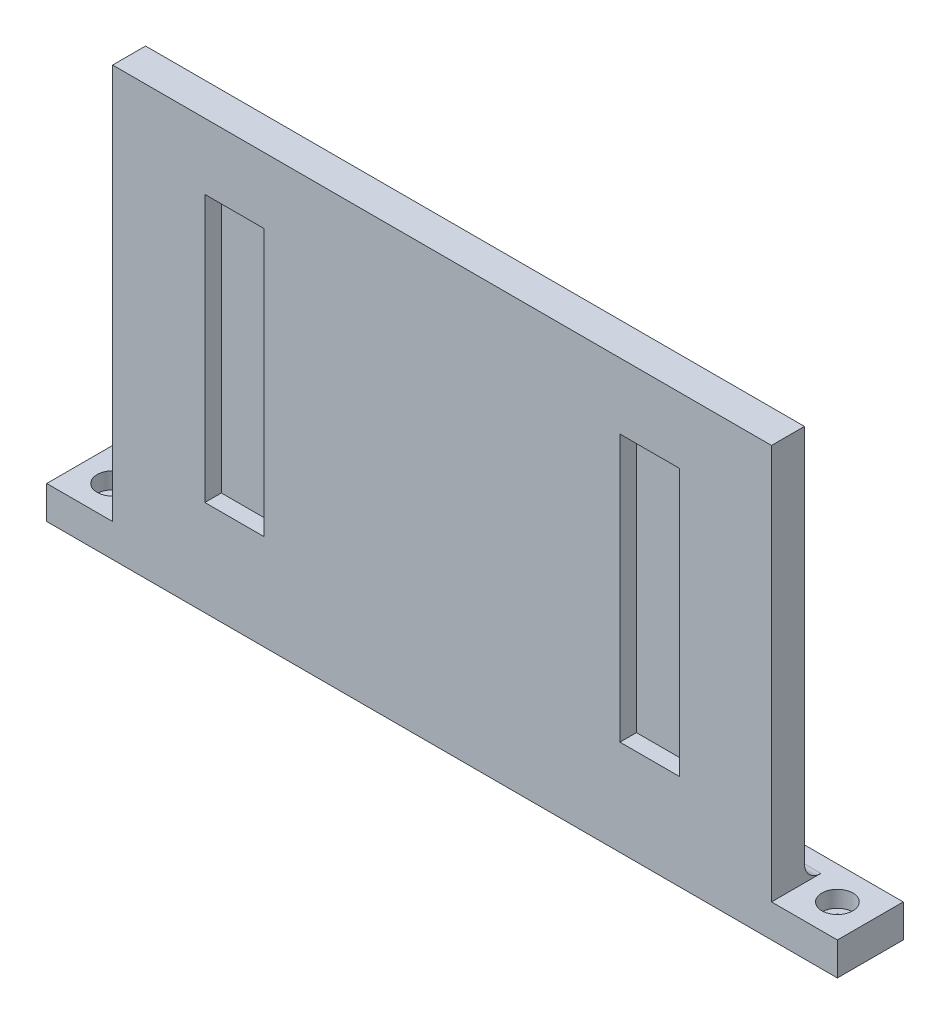
ISO-10303-21;
HEADER;
FILE_DESCRIPTION(('STEP AP214'),'2;1');
FILE_NAME('part.step','',(''),(''),'','','');
FILE_SCHEMA(('AUTOMOTIVE_DESIGN { 1 0 10303 214 1 1 1 1 }'));
ENDSEC;
DATA;
#1=APPLICATION_CONTEXT('core data for automotive mechanical design processes');
#2=APPLICATION_PROTOCOL_DEFINITION('international standard','automotive_design',2000,#1);
#3=PRODUCT_CONTEXT('',#1,'mechanical');
#4=PRODUCT('Part','Part','',(#3));
#5=PRODUCT_RELATED_PRODUCT_CATEGORY('part','',(#4));
#6=PRODUCT_DEFINITION_FORMATION('','',#4);
#7=PRODUCT_DEFINITION_CONTEXT('part definition',#1,'design');
#8=PRODUCT_DEFINITION('design','',#6,#7);
#9=PRODUCT_DEFINITION_SHAPE('','',#8);
#10=(LENGTH_UNIT() NAMED_UNIT(*) SI_UNIT(.MILLI.,.METRE.));
#11=(NAMED_UNIT(*) PLANE_ANGLE_UNIT() SI_UNIT($,.RADIAN.));
#12=(NAMED_UNIT(*) SI_UNIT($,.STERADIAN.) SOLID_ANGLE_UNIT());
#13=UNCERTAINTY_MEASURE_WITH_UNIT(LENGTH_MEASURE(1.E-05),#10,'distance_accuracy_value','');
#14=(GEOMETRIC_REPRESENTATION_CONTEXT(3) GLOBAL_UNCERTAINTY_ASSIGNED_CONTEXT((#13)) GLOBAL_UNIT_ASSIGNED_CONTEXT((#10,
#11,#12)) REPRESENTATION_CONTEXT('',''));
#15=CARTESIAN_POINT('',(0.,0.,0.));
#16=DIRECTION('',(0.,0.,1.));
#17=DIRECTION('',(1.,0.,0.));
#18=AXIS2_PLACEMENT_3D('',#15,#16,#17);
#19=CARTESIAN_POINT('',(10.,18.4852813742386,10.));
#20=DIRECTION('',(0.,-1.,0.));
#21=DIRECTION('',(0.,0.,-1.));
#22=AXIS2_PLACEMENT_3D('',#19,#20,#21);
#23=CYLINDRICAL_SURFACE('',#22,2.5);
#24=CARTESIAN_POINT('',(10.,0.,10.));
#25=DIRECTION('',(0.,-1.,0.));
#26=DIRECTION('',(0.,0.,-1.));
#27=AXIS2_PLACEMENT_3D('',#24,#25,#26);
#28=CIRCLE('',#27,2.5);
#29=CARTESIAN_POINT('',(10.,0.,7.5));
#30=VERTEX_POINT('',#29);
#31=EDGE_CURVE('E245',#30,#30,#28,.T.);
#32=ORIENTED_EDGE('',*,*,#31,.T.);
#33=EDGE_LOOP('',(#32));
#34=FACE_BOUND('',#33,.T.);
#35=CARTESIAN_POINT('',(10.,5.,10.));
#36=DIRECTION('',(0.,1.,0.));
#37=DIRECTION('',(-1.,0.,0.));
#38=AXIS2_PLACEMENT_3D('',#35,#36,#37);
#39=CIRCLE('',#38,2.5);
#40=CARTESIAN_POINT('',(7.5,5.,10.));
#41=VERTEX_POINT('',#40);
#42=EDGE_CURVE('E45',#41,#41,#39,.F.);
#43=ORIENTED_EDGE('',*,*,#42,.F.);
#44=EDGE_LOOP('',(#43));
#45=FACE_BOUND('',#44,.T.);
#46=ADVANCED_FACE('F41',(#34,#45),#23,.F.);
#47=CARTESIAN_POINT('',(230.,18.4852813742386,10.));
#48=DIRECTION('',(0.,-1.,0.));
#49=DIRECTION('',(0.,0.,-1.));
#50=AXIS2_PLACEMENT_3D('',#47,#48,#49);
#51=CYLINDRICAL_SURFACE('',#50,2.5);
#52=CARTESIAN_POINT('',(230.,0.,10.));
#53=DIRECTION('',(0.,-1.,0.));
#54=DIRECTION('',(0.,0.,-1.));
#55=AXIS2_PLACEMENT_3D('',#52,#53,#54);
#56=CIRCLE('',#55,2.5);
#57=CARTESIAN_POINT('',(230.,0.,7.50000000000001));
#58=VERTEX_POINT('',#57);
#59=EDGE_CURVE('E242',#58,#58,#56,.T.);
#60=ORIENTED_EDGE('',*,*,#59,.T.);
#61=EDGE_LOOP('',(#60));
#62=FACE_BOUND('',#61,.T.);
#63=CARTESIAN_POINT('',(230.,5.00000000000002,10.));
#64=DIRECTION('',(0.,1.,0.));
#65=DIRECTION('',(-1.,0.,0.));
#66=AXIS2_PLACEMENT_3D('',#63,#64,#65);
#67=CIRCLE('',#66,2.5);
#68=CARTESIAN_POINT('',(227.5,5.00000000000002,10.));
#69=VERTEX_POINT('',#68);
#70=EDGE_CURVE('E233',#69,#69,#67,.F.);
#71=ORIENTED_EDGE('',*,*,#70,.F.);
#72=EDGE_LOOP('',(#71));
#73=FACE_BOUND('',#72,.T.);
#74=ADVANCED_FACE('F320',(#62,#73),#51,.F.);
#75=CARTESIAN_POINT('',(220.,10.,20.));
#76=DIRECTION('',(-1.,0.,0.));
#77=DIRECTION('',(0.,0.,1.));
#78=AXIS2_PLACEMENT_3D('',#75,#76,#77);
#79=PLANE('',#78);
#80=DIRECTION('',(0.,-1.,0.));
#81=VECTOR('',#80,1.);
#82=CARTESIAN_POINT('',(220.,130.,10.));
#83=LINE('',#82,#81);
#84=CARTESIAN_POINT('',(220.,130.,10.));
#85=VERTEX_POINT('',#84);
#86=CARTESIAN_POINT('',(220.,15.,10.));
#87=VERTEX_POINT('',#86);
#88=EDGE_CURVE('E248',#85,#87,#83,.T.);
#89=ORIENTED_EDGE('',*,*,#88,.F.);
#90=DIRECTION('',(0.,0.,-1.));
#91=VECTOR('',#90,1.);
#92=CARTESIAN_POINT('',(220.,130.,20.));
#93=LINE('',#92,#91);
#94=CARTESIAN_POINT('',(220.,130.,20.));
#95=VERTEX_POINT('',#94);
#96=EDGE_CURVE('E290',#95,#85,#93,.T.);
#97=ORIENTED_EDGE('',*,*,#96,.F.);
#98=DIRECTION('',(0.,1.,0.));
#99=VECTOR('',#98,1.);
#100=CARTESIAN_POINT('',(220.,10.,20.));
#101=LINE('',#100,#99);
#102=CARTESIAN_POINT('',(220.,10.,20.));
#103=VERTEX_POINT('',#102);
#104=EDGE_CURVE('E266',#103,#95,#101,.T.);
#105=ORIENTED_EDGE('',*,*,#104,.F.);
#106=DIRECTION('',(0.,0.,-1.));
#107=VECTOR('',#106,1.);
#108=CARTESIAN_POINT('',(220.,10.,20.));
#109=LINE('',#108,#107);
#110=CARTESIAN_POINT('',(220.,10.,5.));
#111=VERTEX_POINT('',#110);
#112=EDGE_CURVE('E293',#103,#111,#109,.T.);
#113=ORIENTED_EDGE('',*,*,#112,.T.);
#114=CARTESIAN_POINT('',(220.,15.,5.));
#115=DIRECTION('',(-1.,0.,0.));
#116=DIRECTION('',(0.,0.,1.));
#117=AXIS2_PLACEMENT_3D('',#114,#115,#116);
#118=CIRCLE('',#117,5.);
#119=EDGE_CURVE('E11',#111,#87,#118,.T.);
#120=ORIENTED_EDGE('',*,*,#119,.T.);
#121=EDGE_LOOP('',(#89,#97,#105,#113,#120));
#122=FACE_BOUND('',#121,.T.);
#123=ADVANCED_FACE('F326',(#122),#79,.F.);
#124=CARTESIAN_POINT('',(220.,130.,20.));
#125=DIRECTION('',(0.,-1.,0.));
#126=DIRECTION('',(1.,0.,0.));
#127=AXIS2_PLACEMENT_3D('',#124,#125,#126);
#128=PLANE('',#127);
#129=DIRECTION('',(1.,0.,0.));
#130=VECTOR('',#129,1.);
#131=CARTESIAN_POINT('',(220.,130.,10.));
#132=LINE('',#131,#130);
#133=CARTESIAN_POINT('',(20.,130.,10.));
#134=VERTEX_POINT('',#133);
#135=EDGE_CURVE('E253',#134,#85,#132,.T.);
#136=ORIENTED_EDGE('',*,*,#135,.F.);
#137=DIRECTION('',(0.,0.,-1.));
#138=VECTOR('',#137,1.);
#139=CARTESIAN_POINT('',(20.,130.,20.));
#140=LINE('',#139,#138);
#141=CARTESIAN_POINT('',(20.,130.,20.));
#142=VERTEX_POINT('',#141);
#143=EDGE_CURVE('E287',#142,#134,#140,.T.);
#144=ORIENTED_EDGE('',*,*,#143,.F.);
#145=DIRECTION('',(-1.,0.,0.));
#146=VECTOR('',#145,1.);
#147=CARTESIAN_POINT('',(220.,130.,20.));
#148=LINE('',#147,#146);
#149=EDGE_CURVE('E268',#95,#142,#148,.T.);
#150=ORIENTED_EDGE('',*,*,#149,.F.);
#151=ORIENTED_EDGE('',*,*,#96,.T.);
#152=EDGE_LOOP('',(#136,#144,#150,#151));
#153=FACE_BOUND('',#152,.T.);
#154=ADVANCED_FACE('F352',(#153),#128,.F.);
#155=CARTESIAN_POINT('',(20.,130.,20.));
#156=DIRECTION('',(1.,0.,0.));
#157=DIRECTION('',(0.,1.,0.));
#158=AXIS2_PLACEMENT_3D('',#155,#156,#157);
#159=PLANE('',#158);
#160=DIRECTION('',(0.,1.,0.));
#161=VECTOR('',#160,1.);
#162=CARTESIAN_POINT('',(20.,130.,10.));
#163=LINE('',#162,#161);
#164=CARTESIAN_POINT('',(20.,15.,10.));
#165=VERTEX_POINT('',#164);
#166=EDGE_CURVE('E251',#165,#134,#163,.T.);
#167=ORIENTED_EDGE('',*,*,#166,.F.);
#168=CARTESIAN_POINT('',(20.,15.,5.));
#169=DIRECTION('',(1.,0.,0.));
#170=DIRECTION('',(0.,1.,0.));
#171=AXIS2_PLACEMENT_3D('',#168,#169,#170);
#172=CIRCLE('',#171,5.);
#173=CARTESIAN_POINT('',(20.,10.,5.));
#174=VERTEX_POINT('',#173);
#175=EDGE_CURVE('E50',#165,#174,#172,.T.);
#176=ORIENTED_EDGE('',*,*,#175,.T.);
#177=DIRECTION('',(0.,0.,-1.));
#178=VECTOR('',#177,1.);
#179=CARTESIAN_POINT('',(20.,10.,20.));
#180=LINE('',#179,#178);
#181=CARTESIAN_POINT('',(20.,10.,20.));
#182=VERTEX_POINT('',#181);
#183=EDGE_CURVE('E285',#182,#174,#180,.T.);
#184=ORIENTED_EDGE('',*,*,#183,.F.);
#185=DIRECTION('',(0.,-1.,0.));
#186=VECTOR('',#185,1.);
#187=CARTESIAN_POINT('',(20.,130.,20.));
#188=LINE('',#187,#186);
#189=EDGE_CURVE('E270',#142,#182,#188,.T.);
#190=ORIENTED_EDGE('',*,*,#189,.F.);
#191=ORIENTED_EDGE('',*,*,#143,.T.);
#192=EDGE_LOOP('',(#167,#176,#184,#190,#191));
#193=FACE_BOUND('',#192,.T.);
#194=ADVANCED_FACE('F348',(#193),#159,.F.);
#195=CARTESIAN_POINT('',(0.,10.,20.));
#196=DIRECTION('',(1.,0.,0.));
#197=DIRECTION('',(0.,1.,0.));
#198=AXIS2_PLACEMENT_3D('',#195,#196,#197);
#199=PLANE('',#198);
#200=DIRECTION('',(0.,-1.,0.));
#201=VECTOR('',#200,1.);
#202=CARTESIAN_POINT('',(0.,10.,0.));
#203=LINE('',#202,#201);
#204=CARTESIAN_POINT('',(0.,10.,0.));
#205=VERTEX_POINT('',#204);
#206=CARTESIAN_POINT('',(0.,0.,0.));
#207=VERTEX_POINT('',#206);
#208=EDGE_CURVE('E255',#205,#207,#203,.T.);
#209=ORIENTED_EDGE('',*,*,#208,.T.);
#210=DIRECTION('',(0.,0.,-1.));
#211=VECTOR('',#210,1.);
#212=CARTESIAN_POINT('',(0.,0.,20.));
#213=LINE('',#212,#211);
#214=CARTESIAN_POINT('',(0.,0.,20.));
#215=VERTEX_POINT('',#214);
#216=EDGE_CURVE('E301',#215,#207,#213,.T.);
#217=ORIENTED_EDGE('',*,*,#216,.F.);
#218=DIRECTION('',(0.,-1.,0.));
#219=VECTOR('',#218,1.);
#220=CARTESIAN_POINT('',(0.,10.,20.));
#221=LINE('',#220,#219);
#222=CARTESIAN_POINT('',(0.,10.,20.));
#223=VERTEX_POINT('',#222);
#224=EDGE_CURVE('E256',#223,#215,#221,.T.);
#225=ORIENTED_EDGE('',*,*,#224,.F.);
#226=DIRECTION('',(0.,0.,-1.));
#227=VECTOR('',#226,1.);
#228=CARTESIAN_POINT('',(0.,10.,20.));
#229=LINE('',#228,#227);
#230=EDGE_CURVE('E274',#223,#205,#229,.T.);
#231=ORIENTED_EDGE('',*,*,#230,.T.);
#232=EDGE_LOOP('',(#209,#217,#225,#231));
#233=FACE_BOUND('',#232,.T.);
#234=ADVANCED_FACE('F351',(#233),#199,.F.);
#235=CARTESIAN_POINT('',(0.,0.,20.));
#236=DIRECTION('',(0.,1.,0.));
#237=DIRECTION('',(0.,0.,1.));
#238=AXIS2_PLACEMENT_3D('',#235,#236,#237);
#239=PLANE('',#238);
#240=DIRECTION('',(1.,0.,0.));
#241=VECTOR('',#240,1.);
#242=CARTESIAN_POINT('',(0.,0.,0.));
#243=LINE('',#242,#241);
#244=CARTESIAN_POINT('',(240.,0.,0.));
#245=VERTEX_POINT('',#244);
#246=EDGE_CURVE('E277',#207,#245,#243,.T.);
#247=ORIENTED_EDGE('',*,*,#246,.T.);
#248=DIRECTION('',(0.,0.,-1.));
#249=VECTOR('',#248,1.);
#250=CARTESIAN_POINT('',(240.,0.,20.));
#251=LINE('',#250,#249);
#252=CARTESIAN_POINT('',(240.,0.,20.));
#253=VERTEX_POINT('',#252);
#254=EDGE_CURVE('E298',#253,#245,#251,.T.);
#255=ORIENTED_EDGE('',*,*,#254,.F.);
#256=DIRECTION('',(1.,0.,0.));
#257=VECTOR('',#256,1.);
#258=CARTESIAN_POINT('',(0.,0.,20.));
#259=LINE('',#258,#257);
#260=EDGE_CURVE('E259',#215,#253,#259,.T.);
#261=ORIENTED_EDGE('',*,*,#260,.F.);
#262=ORIENTED_EDGE('',*,*,#216,.T.);
#263=EDGE_LOOP('',(#247,#255,#261,#262));
#264=FACE_BOUND('',#263,.T.);
#265=ORIENTED_EDGE('',*,*,#31,.F.);
#266=EDGE_LOOP('',(#265));
#267=FACE_BOUND('',#266,.T.);
#268=ORIENTED_EDGE('',*,*,#59,.F.);
#269=EDGE_LOOP('',(#268));
#270=FACE_BOUND('',#269,.T.);
#271=ADVANCED_FACE('F362',(#264,#267,#270),#239,.F.);
#272=CARTESIAN_POINT('',(240.,0.,20.));
#273=DIRECTION('',(-1.,0.,0.));
#274=DIRECTION('',(0.,-1.,0.));
#275=AXIS2_PLACEMENT_3D('',#272,#273,#274);
#276=PLANE('',#275);
#277=DIRECTION('',(0.,1.,0.));
#278=VECTOR('',#277,1.);
#279=CARTESIAN_POINT('',(240.,0.,0.));
#280=LINE('',#279,#278);
#281=CARTESIAN_POINT('',(240.,10.,0.));
#282=VERTEX_POINT('',#281);
#283=EDGE_CURVE('E279',#245,#282,#280,.T.);
#284=ORIENTED_EDGE('',*,*,#283,.T.);
#285=DIRECTION('',(0.,0.,-1.));
#286=VECTOR('',#285,1.);
#287=CARTESIAN_POINT('',(240.,10.,20.));
#288=LINE('',#287,#286);
#289=CARTESIAN_POINT('',(240.,10.,20.));
#290=VERTEX_POINT('',#289);
#291=EDGE_CURVE('E295',#290,#282,#288,.T.);
#292=ORIENTED_EDGE('',*,*,#291,.F.);
#293=DIRECTION('',(0.,1.,0.));
#294=VECTOR('',#293,1.);
#295=CARTESIAN_POINT('',(240.,0.,20.));
#296=LINE('',#295,#294);
#297=EDGE_CURVE('E262',#253,#290,#296,.T.);
#298=ORIENTED_EDGE('',*,*,#297,.F.);
#299=ORIENTED_EDGE('',*,*,#254,.T.);
#300=EDGE_LOOP('',(#284,#292,#298,#299));
#301=FACE_BOUND('',#300,.T.);
#302=ADVANCED_FACE('F346',(#301),#276,.F.);
#303=CARTESIAN_POINT('',(20.,10.,20.));
#304=DIRECTION('',(0.,-1.,0.));
#305=DIRECTION('',(1.,0.,0.));
#306=AXIS2_PLACEMENT_3D('',#303,#304,#305);
#307=PLANE('',#306);
#308=CARTESIAN_POINT('',(230.,10.,10.));
#309=DIRECTION('',(0.,1.,0.));
#310=DIRECTION('',(-1.,0.,0.));
#311=AXIS2_PLACEMENT_3D('',#308,#309,#310);
#312=CIRCLE('',#311,4.70000000000001);
#313=CARTESIAN_POINT('',(225.3,10.,10.));
#314=VERTEX_POINT('',#313);
#315=EDGE_CURVE('E234',#314,#314,#312,.T.);
#316=ORIENTED_EDGE('',*,*,#315,.F.);
#317=EDGE_LOOP('',(#316));
#318=FACE_BOUND('',#317,.T.);
#319=CARTESIAN_POINT('',(10.,10.,10.));
#320=DIRECTION('',(0.,1.,0.));
#321=DIRECTION('',(-1.,0.,0.));
#322=AXIS2_PLACEMENT_3D('',#319,#320,#321);
#323=CIRCLE('',#322,4.7);
#324=CARTESIAN_POINT('',(5.3,10.,10.));
#325=VERTEX_POINT('',#324);
#326=EDGE_CURVE('E237',#325,#325,#323,.T.);
#327=ORIENTED_EDGE('',*,*,#326,.F.);
#328=EDGE_LOOP('',(#327));
#329=FACE_BOUND('',#328,.T.);
#330=ORIENTED_EDGE('',*,*,#183,.T.);
#331=DIRECTION('',(-1.,0.,0.));
#332=VECTOR('',#331,1.);
#333=CARTESIAN_POINT('',(20.,10.,5.));
#334=LINE('',#333,#332);
#335=EDGE_CURVE('E307',#174,#111,#334,.F.);
#336=ORIENTED_EDGE('',*,*,#335,.T.);
#337=ORIENTED_EDGE('',*,*,#112,.F.);
#338=DIRECTION('',(-1.,0.,0.));
#339=VECTOR('',#338,1.);
#340=CARTESIAN_POINT('',(240.,10.,20.));
#341=LINE('',#340,#339);
#342=EDGE_CURVE('E264',#290,#103,#341,.T.);
#343=ORIENTED_EDGE('',*,*,#342,.F.);
#344=ORIENTED_EDGE('',*,*,#291,.T.);
#345=DIRECTION('',(-1.,0.,0.));
#346=VECTOR('',#345,1.);
#347=CARTESIAN_POINT('',(20.,10.,0.));
#348=LINE('',#347,#346);
#349=EDGE_CURVE('E260',#282,#205,#348,.T.);
#350=ORIENTED_EDGE('',*,*,#349,.T.);
#351=ORIENTED_EDGE('',*,*,#230,.F.);
#352=DIRECTION('',(-1.,0.,0.));
#353=VECTOR('',#352,1.);
#354=CARTESIAN_POINT('',(20.,10.,20.));
#355=LINE('',#354,#353);
#356=EDGE_CURVE('E272',#182,#223,#355,.T.);
#357=ORIENTED_EDGE('',*,*,#356,.F.);
#358=EDGE_LOOP('',(#330,#336,#337,#343,#344,#350,#351,#357));
#359=FACE_BOUND('',#358,.T.);
#360=ADVANCED_FACE('F339',(#318,#329,#359),#307,.F.);
#361=CARTESIAN_POINT('',(0.,0.,20.));
#362=DIRECTION('',(0.,0.,1.));
#363=DIRECTION('',(1.,0.,0.));
#364=AXIS2_PLACEMENT_3D('',#361,#362,#363);
#365=PLANE('',#364);
#366=DIRECTION('',(0.,-1.,0.));
#367=VECTOR('',#366,1.);
#368=CARTESIAN_POINT('',(48.,110.,20.));
#369=LINE('',#368,#367);
#370=CARTESIAN_POINT('',(48.,110.,20.));
#371=VERTEX_POINT('',#370);
#372=CARTESIAN_POINT('',(48.,29.,20.));
#373=VERTEX_POINT('',#372);
#374=EDGE_CURVE('E58',#371,#373,#369,.T.);
#375=ORIENTED_EDGE('',*,*,#374,.F.);
#376=DIRECTION('',(-1.,0.,0.));
#377=VECTOR('',#376,1.);
#378=CARTESIAN_POINT('',(48.,110.,20.));
#379=LINE('',#378,#377);
#380=CARTESIAN_POINT('',(66.,110.,20.));
#381=VERTEX_POINT('',#380);
#382=EDGE_CURVE('E181',#381,#371,#379,.T.);
#383=ORIENTED_EDGE('',*,*,#382,.F.);
#384=DIRECTION('',(0.,1.,0.));
#385=VECTOR('',#384,1.);
#386=CARTESIAN_POINT('',(66.,110.,20.));
#387=LINE('',#386,#385);
#388=CARTESIAN_POINT('',(66.,29.,20.));
#389=VERTEX_POINT('',#388);
#390=EDGE_CURVE('E184',#389,#381,#387,.T.);
#391=ORIENTED_EDGE('',*,*,#390,.F.);
#392=DIRECTION('',(1.,0.,0.));
#393=VECTOR('',#392,1.);
#394=CARTESIAN_POINT('',(48.,29.,20.));
#395=LINE('',#394,#393);
#396=EDGE_CURVE('E190',#373,#389,#395,.T.);
#397=ORIENTED_EDGE('',*,*,#396,.F.);
#398=EDGE_LOOP('',(#375,#383,#391,#397));
#399=FACE_BOUND('',#398,.T.);
#400=DIRECTION('',(0.,-1.,0.));
#401=VECTOR('',#400,1.);
#402=CARTESIAN_POINT('',(174.,110.,20.));
#403=LINE('',#402,#401);
#404=CARTESIAN_POINT('',(174.,110.,20.));
#405=VERTEX_POINT('',#404);
#406=CARTESIAN_POINT('',(174.,29.,20.));
#407=VERTEX_POINT('',#406);
#408=EDGE_CURVE('E66',#405,#407,#403,.T.);
#409=ORIENTED_EDGE('',*,*,#408,.F.);
#410=DIRECTION('',(-1.,0.,0.));
#411=VECTOR('',#410,1.);
#412=CARTESIAN_POINT('',(174.,110.,20.));
#413=LINE('',#412,#411);
#414=CARTESIAN_POINT('',(192.,110.,20.));
#415=VERTEX_POINT('',#414);
#416=EDGE_CURVE('E209',#415,#405,#413,.T.);
#417=ORIENTED_EDGE('',*,*,#416,.F.);
#418=DIRECTION('',(0.,1.,0.));
#419=VECTOR('',#418,1.);
#420=CARTESIAN_POINT('',(192.,110.,20.));
#421=LINE('',#420,#419);
#422=CARTESIAN_POINT('',(192.,29.,20.));
#423=VERTEX_POINT('',#422);
#424=EDGE_CURVE('E212',#423,#415,#421,.T.);
#425=ORIENTED_EDGE('',*,*,#424,.F.);
#426=DIRECTION('',(1.,0.,0.));
#427=VECTOR('',#426,1.);
#428=CARTESIAN_POINT('',(174.,29.,20.));
#429=LINE('',#428,#427);
#430=EDGE_CURVE('E216',#407,#423,#429,.T.);
#431=ORIENTED_EDGE('',*,*,#430,.F.);
#432=EDGE_LOOP('',(#409,#417,#425,#431));
#433=FACE_BOUND('',#432,.T.);
#434=ORIENTED_EDGE('',*,*,#224,.T.);
#435=ORIENTED_EDGE('',*,*,#260,.T.);
#436=ORIENTED_EDGE('',*,*,#297,.T.);
#437=ORIENTED_EDGE('',*,*,#342,.T.);
#438=ORIENTED_EDGE('',*,*,#104,.T.);
#439=ORIENTED_EDGE('',*,*,#149,.T.);
#440=ORIENTED_EDGE('',*,*,#189,.T.);
#441=ORIENTED_EDGE('',*,*,#356,.T.);
#442=EDGE_LOOP('',(#434,#435,#436,#437,#438,#439,#440,#441));
#443=FACE_BOUND('',#442,.T.);
#444=ADVANCED_FACE('F336',(#399,#433,#443),#365,.T.);
#445=CARTESIAN_POINT('',(0.,0.,0.));
#446=DIRECTION('',(0.,0.,1.));
#447=DIRECTION('',(1.,0.,0.));
#448=AXIS2_PLACEMENT_3D('',#445,#446,#447);
#449=PLANE('',#448);
#450=ORIENTED_EDGE('',*,*,#349,.F.);
#451=ORIENTED_EDGE('',*,*,#283,.F.);
#452=ORIENTED_EDGE('',*,*,#246,.F.);
#453=ORIENTED_EDGE('',*,*,#208,.F.);
#454=EDGE_LOOP('',(#450,#451,#452,#453));
#455=FACE_BOUND('',#454,.T.);
#456=ADVANCED_FACE('F334',(#455),#449,.F.);
#457=CARTESIAN_POINT('',(0.,0.,10.));
#458=DIRECTION('',(0.,0.,-1.));
#459=DIRECTION('',(-1.,0.,0.));
#460=AXIS2_PLACEMENT_3D('',#457,#458,#459);
#461=PLANE('',#460);
#462=ORIENTED_EDGE('',*,*,#88,.T.);
#463=DIRECTION('',(-1.,0.,0.));
#464=VECTOR('',#463,1.);
#465=CARTESIAN_POINT('',(0.,15.,10.));
#466=LINE('',#465,#464);
#467=EDGE_CURVE('E304',#87,#165,#466,.T.);
#468=ORIENTED_EDGE('',*,*,#467,.T.);
#469=ORIENTED_EDGE('',*,*,#166,.T.);
#470=ORIENTED_EDGE('',*,*,#135,.T.);
#471=EDGE_LOOP('',(#462,#468,#469,#470));
#472=FACE_BOUND('',#471,.T.);
#473=ADVANCED_FACE('F331',(#472),#461,.T.);
#474=CARTESIAN_POINT('',(0.,15.,5.));
#475=DIRECTION('',(-1.,0.,0.));
#476=DIRECTION('',(0.,-1.,0.));
#477=AXIS2_PLACEMENT_3D('',#474,#475,#476);
#478=CYLINDRICAL_SURFACE('',#477,5.);
#479=ORIENTED_EDGE('',*,*,#119,.F.);
#480=ORIENTED_EDGE('',*,*,#335,.F.);
#481=ORIENTED_EDGE('',*,*,#175,.F.);
#482=ORIENTED_EDGE('',*,*,#467,.F.);
#483=EDGE_LOOP('',(#479,#480,#481,#482));
#484=FACE_BOUND('',#483,.T.);
#485=ADVANCED_FACE('F43',(#484),#478,.F.);
#486=CARTESIAN_POINT('',(230.,5.00000000000002,10.));
#487=DIRECTION('',(0.,1.,0.));
#488=DIRECTION('',(-1.,0.,0.));
#489=AXIS2_PLACEMENT_3D('',#486,#487,#488);
#490=PLANE('',#489);
#491=CARTESIAN_POINT('',(230.,5.00000000000002,10.));
#492=DIRECTION('',(0.,1.,0.));
#493=DIRECTION('',(-1.,0.,0.));
#494=AXIS2_PLACEMENT_3D('',#491,#492,#493);
#495=CIRCLE('',#494,4.70000000000001);
#496=CARTESIAN_POINT('',(225.3,5.00000000000002,10.));
#497=VERTEX_POINT('',#496);
#498=EDGE_CURVE('E230',#497,#497,#495,.T.);
#499=ORIENTED_EDGE('',*,*,#498,.T.);
#500=EDGE_LOOP('',(#499));
#501=FACE_BOUND('',#500,.T.);
#502=ORIENTED_EDGE('',*,*,#70,.T.);
#503=EDGE_LOOP('',(#502));
#504=FACE_BOUND('',#503,.T.);
#505=ADVANCED_FACE('F398',(#501,#504),#490,.T.);
#506=CARTESIAN_POINT('',(230.,5.00000000000002,10.));
#507=DIRECTION('',(0.,1.,0.));
#508=DIRECTION('',(-1.,0.,0.));
#509=AXIS2_PLACEMENT_3D('',#506,#507,#508);
#510=CYLINDRICAL_SURFACE('',#509,4.70000000000001);
#511=ORIENTED_EDGE('',*,*,#498,.F.);
#512=EDGE_LOOP('',(#511));
#513=FACE_BOUND('',#512,.T.);
#514=ORIENTED_EDGE('',*,*,#315,.T.);
#515=EDGE_LOOP('',(#514));
#516=FACE_BOUND('',#515,.T.);
#517=ADVANCED_FACE('F402',(#513,#516),#510,.F.);
#518=CARTESIAN_POINT('',(10.,5.,10.));
#519=DIRECTION('',(0.,1.,0.));
#520=DIRECTION('',(-1.,0.,0.));
#521=AXIS2_PLACEMENT_3D('',#518,#519,#520);
#522=PLANE('',#521);
#523=CARTESIAN_POINT('',(10.,5.,10.));
#524=DIRECTION('',(0.,1.,0.));
#525=DIRECTION('',(-1.,0.,0.));
#526=AXIS2_PLACEMENT_3D('',#523,#524,#525);
#527=CIRCLE('',#526,4.7);
#528=CARTESIAN_POINT('',(5.3,5.,10.));
#529=VERTEX_POINT('',#528);
#530=EDGE_CURVE('E196',#529,#529,#527,.T.);
#531=ORIENTED_EDGE('',*,*,#530,.T.);
#532=EDGE_LOOP('',(#531));
#533=FACE_BOUND('',#532,.T.);
#534=ORIENTED_EDGE('',*,*,#42,.T.);
#535=EDGE_LOOP('',(#534));
#536=FACE_BOUND('',#535,.T.);
#537=ADVANCED_FACE('F317',(#533,#536),#522,.T.);
#538=CARTESIAN_POINT('',(10.,5.,10.));
#539=DIRECTION('',(0.,1.,0.));
#540=DIRECTION('',(-1.,0.,0.));
#541=AXIS2_PLACEMENT_3D('',#538,#539,#540);
#542=CYLINDRICAL_SURFACE('',#541,4.7);
#543=ORIENTED_EDGE('',*,*,#530,.F.);
#544=EDGE_LOOP('',(#543));
#545=FACE_BOUND('',#544,.T.);
#546=ORIENTED_EDGE('',*,*,#326,.T.);
#547=EDGE_LOOP('',(#546));
#548=FACE_BOUND('',#547,.T.);
#549=ADVANCED_FACE('F414',(#545,#548),#542,.F.);
#550=CARTESIAN_POINT('',(174.,110.,15.));
#551=DIRECTION('',(-1.,0.,0.));
#552=DIRECTION('',(0.,0.,1.));
#553=AXIS2_PLACEMENT_3D('',#550,#551,#552);
#554=PLANE('',#553);
#555=ORIENTED_EDGE('',*,*,#408,.T.);
#556=DIRECTION('',(0.,0.,1.));
#557=VECTOR('',#556,1.);
#558=CARTESIAN_POINT('',(174.,29.,15.));
#559=LINE('',#558,#557);
#560=CARTESIAN_POINT('',(174.,29.,15.));
#561=VERTEX_POINT('',#560);
#562=EDGE_CURVE('E200',#561,#407,#559,.T.);
#563=ORIENTED_EDGE('',*,*,#562,.F.);
#564=DIRECTION('',(0.,-1.,0.));
#565=VECTOR('',#564,1.);
#566=CARTESIAN_POINT('',(174.,110.,15.));
#567=LINE('',#566,#565);
#568=CARTESIAN_POINT('',(174.,110.,15.));
#569=VERTEX_POINT('',#568);
#570=EDGE_CURVE('E213',#569,#561,#567,.T.);
#571=ORIENTED_EDGE('',*,*,#570,.F.);
#572=DIRECTION('',(0.,0.,1.));
#573=VECTOR('',#572,1.);
#574=CARTESIAN_POINT('',(174.,110.,15.));
#575=LINE('',#574,#573);
#576=EDGE_CURVE('E207',#569,#405,#575,.T.);
#577=ORIENTED_EDGE('',*,*,#576,.T.);
#578=EDGE_LOOP('',(#555,#563,#571,#577));
#579=FACE_BOUND('',#578,.T.);
#580=ADVANCED_FACE('F416',(#579),#554,.F.);
#581=CARTESIAN_POINT('',(174.,110.,15.));
#582=DIRECTION('',(0.,1.,0.));
#583=DIRECTION('',(0.,0.,1.));
#584=AXIS2_PLACEMENT_3D('',#581,#582,#583);
#585=PLANE('',#584);
#586=ORIENTED_EDGE('',*,*,#416,.T.);
#587=ORIENTED_EDGE('',*,*,#576,.F.);
#588=DIRECTION('',(-1.,0.,0.));
#589=VECTOR('',#588,1.);
#590=CARTESIAN_POINT('',(174.,110.,15.));
#591=LINE('',#590,#589);
#592=CARTESIAN_POINT('',(192.,110.,15.));
#593=VERTEX_POINT('',#592);
#594=EDGE_CURVE('E202',#593,#569,#591,.T.);
#595=ORIENTED_EDGE('',*,*,#594,.F.);
#596=DIRECTION('',(0.,0.,1.));
#597=VECTOR('',#596,1.);
#598=CARTESIAN_POINT('',(192.,110.,15.));
#599=LINE('',#598,#597);
#600=EDGE_CURVE('E205',#593,#415,#599,.T.);
#601=ORIENTED_EDGE('',*,*,#600,.T.);
#602=EDGE_LOOP('',(#586,#587,#595,#601));
#603=FACE_BOUND('',#602,.T.);
#604=ADVANCED_FACE('F438',(#603),#585,.F.);
#605=CARTESIAN_POINT('',(192.,110.,15.));
#606=DIRECTION('',(1.,0.,0.));
#607=DIRECTION('',(0.,0.,-1.));
#608=AXIS2_PLACEMENT_3D('',#605,#606,#607);
#609=PLANE('',#608);
#610=ORIENTED_EDGE('',*,*,#424,.T.);
#611=ORIENTED_EDGE('',*,*,#600,.F.);
#612=DIRECTION('',(0.,1.,0.));
#613=VECTOR('',#612,1.);
#614=CARTESIAN_POINT('',(192.,110.,15.));
#615=LINE('',#614,#613);
#616=CARTESIAN_POINT('',(192.,29.,15.));
#617=VERTEX_POINT('',#616);
#618=EDGE_CURVE('E222',#617,#593,#615,.T.);
#619=ORIENTED_EDGE('',*,*,#618,.F.);
#620=DIRECTION('',(0.,0.,1.));
#621=VECTOR('',#620,1.);
#622=CARTESIAN_POINT('',(192.,29.,15.));
#623=LINE('',#622,#621);
#624=EDGE_CURVE('E203',#617,#423,#623,.T.);
#625=ORIENTED_EDGE('',*,*,#624,.T.);
#626=EDGE_LOOP('',(#610,#611,#619,#625));
#627=FACE_BOUND('',#626,.T.);
#628=ADVANCED_FACE('F445',(#627),#609,.F.);
#629=CARTESIAN_POINT('',(174.,29.,15.));
#630=DIRECTION('',(0.,-1.,0.));
#631=DIRECTION('',(0.,0.,-1.));
#632=AXIS2_PLACEMENT_3D('',#629,#630,#631);
#633=PLANE('',#632);
#634=ORIENTED_EDGE('',*,*,#430,.T.);
#635=ORIENTED_EDGE('',*,*,#624,.F.);
#636=DIRECTION('',(1.,0.,0.));
#637=VECTOR('',#636,1.);
#638=CARTESIAN_POINT('',(174.,29.,15.));
#639=LINE('',#638,#637);
#640=EDGE_CURVE('E225',#561,#617,#639,.T.);
#641=ORIENTED_EDGE('',*,*,#640,.F.);
#642=ORIENTED_EDGE('',*,*,#562,.T.);
#643=EDGE_LOOP('',(#634,#635,#641,#642));
#644=FACE_BOUND('',#643,.T.);
#645=ADVANCED_FACE('F452',(#644),#633,.F.);
#646=CARTESIAN_POINT('',(0.,0.,15.));
#647=DIRECTION('',(0.,0.,1.));
#648=DIRECTION('',(1.,0.,0.));
#649=AXIS2_PLACEMENT_3D('',#646,#647,#648);
#650=PLANE('',#649);
#651=ORIENTED_EDGE('',*,*,#570,.T.);
#652=ORIENTED_EDGE('',*,*,#640,.T.);
#653=ORIENTED_EDGE('',*,*,#618,.T.);
#654=ORIENTED_EDGE('',*,*,#594,.T.);
#655=EDGE_LOOP('',(#651,#652,#653,#654));
#656=FACE_BOUND('',#655,.T.);
#657=ADVANCED_FACE('F411',(#656),#650,.T.);
#658=CARTESIAN_POINT('',(48.,110.,15.));
#659=DIRECTION('',(-1.,0.,0.));
#660=DIRECTION('',(0.,0.,1.));
#661=AXIS2_PLACEMENT_3D('',#658,#659,#660);
#662=PLANE('',#661);
#663=ORIENTED_EDGE('',*,*,#374,.T.);
#664=DIRECTION('',(0.,0.,1.));
#665=VECTOR('',#664,1.);
#666=CARTESIAN_POINT('',(48.,29.,15.));
#667=LINE('',#666,#665);
#668=CARTESIAN_POINT('',(48.,29.,15.));
#669=VERTEX_POINT('',#668);
#670=EDGE_CURVE('E159',#669,#373,#667,.T.);
#671=ORIENTED_EDGE('',*,*,#670,.F.);
#672=DIRECTION('',(0.,-1.,0.));
#673=VECTOR('',#672,1.);
#674=CARTESIAN_POINT('',(48.,110.,15.));
#675=LINE('',#674,#673);
#676=CARTESIAN_POINT('',(48.,110.,15.));
#677=VERTEX_POINT('',#676);
#678=EDGE_CURVE('E163',#677,#669,#675,.T.);
#679=ORIENTED_EDGE('',*,*,#678,.F.);
#680=DIRECTION('',(0.,0.,1.));
#681=VECTOR('',#680,1.);
#682=CARTESIAN_POINT('',(48.,110.,15.));
#683=LINE('',#682,#681);
#684=EDGE_CURVE('E194',#677,#371,#683,.T.);
#685=ORIENTED_EDGE('',*,*,#684,.T.);
#686=EDGE_LOOP('',(#663,#671,#679,#685));
#687=FACE_BOUND('',#686,.T.);
#688=ADVANCED_FACE('F161',(#687),#662,.F.);
#689=CARTESIAN_POINT('',(48.,110.,15.));
#690=DIRECTION('',(0.,1.,0.));
#691=DIRECTION('',(0.,0.,1.));
#692=AXIS2_PLACEMENT_3D('',#689,#690,#691);
#693=PLANE('',#692);
#694=ORIENTED_EDGE('',*,*,#382,.T.);
#695=ORIENTED_EDGE('',*,*,#684,.F.);
#696=DIRECTION('',(-1.,0.,0.));
#697=VECTOR('',#696,1.);
#698=CARTESIAN_POINT('',(48.,110.,15.));
#699=LINE('',#698,#697);
#700=CARTESIAN_POINT('',(66.,110.,15.));
#701=VERTEX_POINT('',#700);
#702=EDGE_CURVE('E169',#701,#677,#699,.T.);
#703=ORIENTED_EDGE('',*,*,#702,.F.);
#704=DIRECTION('',(0.,0.,1.));
#705=VECTOR('',#704,1.);
#706=CARTESIAN_POINT('',(66.,110.,15.));
#707=LINE('',#706,#705);
#708=EDGE_CURVE('E197',#701,#381,#707,.T.);
#709=ORIENTED_EDGE('',*,*,#708,.T.);
#710=EDGE_LOOP('',(#694,#695,#703,#709));
#711=FACE_BOUND('',#710,.T.);
#712=ADVANCED_FACE('F473',(#711),#693,.F.);
#713=CARTESIAN_POINT('',(66.,110.,15.));
#714=DIRECTION('',(1.,0.,0.));
#715=DIRECTION('',(0.,0.,-1.));
#716=AXIS2_PLACEMENT_3D('',#713,#714,#715);
#717=PLANE('',#716);
#718=ORIENTED_EDGE('',*,*,#390,.T.);
#719=ORIENTED_EDGE('',*,*,#708,.F.);
#720=DIRECTION('',(0.,1.,0.));
#721=VECTOR('',#720,1.);
#722=CARTESIAN_POINT('',(66.,110.,15.));
#723=LINE('',#722,#721);
#724=CARTESIAN_POINT('',(66.,29.,15.));
#725=VERTEX_POINT('',#724);
#726=EDGE_CURVE('E177',#725,#701,#723,.T.);
#727=ORIENTED_EDGE('',*,*,#726,.F.);
#728=DIRECTION('',(0.,0.,1.));
#729=VECTOR('',#728,1.);
#730=CARTESIAN_POINT('',(66.,29.,15.));
#731=LINE('',#730,#729);
#732=EDGE_CURVE('E168',#725,#389,#731,.T.);
#733=ORIENTED_EDGE('',*,*,#732,.T.);
#734=EDGE_LOOP('',(#718,#719,#727,#733));
#735=FACE_BOUND('',#734,.T.);
#736=ADVANCED_FACE('F480',(#735),#717,.F.);
#737=CARTESIAN_POINT('',(48.,29.,15.));
#738=DIRECTION('',(0.,-1.,0.));
#739=DIRECTION('',(0.,0.,-1.));
#740=AXIS2_PLACEMENT_3D('',#737,#738,#739);
#741=PLANE('',#740);
#742=ORIENTED_EDGE('',*,*,#396,.T.);
#743=ORIENTED_EDGE('',*,*,#732,.F.);
#744=DIRECTION('',(1.,0.,0.));
#745=VECTOR('',#744,1.);
#746=CARTESIAN_POINT('',(48.,29.,15.));
#747=LINE('',#746,#745);
#748=EDGE_CURVE('E172',#669,#725,#747,.T.);
#749=ORIENTED_EDGE('',*,*,#748,.F.);
#750=ORIENTED_EDGE('',*,*,#670,.T.);
#751=EDGE_LOOP('',(#742,#743,#749,#750));
#752=FACE_BOUND('',#751,.T.);
#753=ADVANCED_FACE('F173',(#752),#741,.F.);
#754=CARTESIAN_POINT('',(0.,0.,15.));
#755=DIRECTION('',(0.,0.,1.));
#756=DIRECTION('',(1.,0.,0.));
#757=AXIS2_PLACEMENT_3D('',#754,#755,#756);
#758=PLANE('',#757);
#759=ORIENTED_EDGE('',*,*,#678,.T.);
#760=ORIENTED_EDGE('',*,*,#748,.T.);
#761=ORIENTED_EDGE('',*,*,#726,.T.);
#762=ORIENTED_EDGE('',*,*,#702,.T.);
#763=EDGE_LOOP('',(#759,#760,#761,#762));
#764=FACE_BOUND('',#763,.T.);
#765=ADVANCED_FACE('F179',(#764),#758,.T.);
#766=CLOSED_SHELL('',(#46,#74,#123,#154,#194,#234,#271,#302,#360,#444,#456,#473,#485,#505,#517,
#537,#549,#580,#604,#628,#645,#657,#688,#712,#736,#753,#765));
#767=MANIFOLD_SOLID_BREP('B2',#766);
#768=ADVANCED_BREP_SHAPE_REPRESENTATION('',(#18,#767),#14);
#769=SHAPE_DEFINITION_REPRESENTATION(#9,#768);
ENDSEC;
END-ISO-10303-21;
